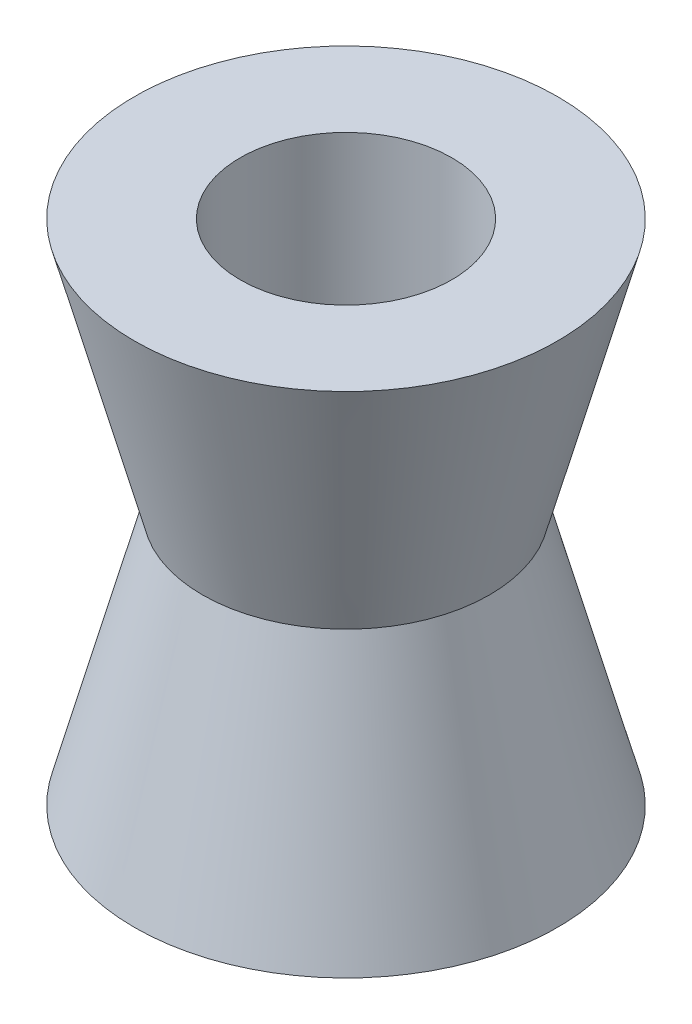
ISO-10303-21;
HEADER;
FILE_DESCRIPTION(('STEP AP214'),'2;1');
FILE_NAME('part.step','',(''),(''),'','','');
FILE_SCHEMA(('AUTOMOTIVE_DESIGN { 1 0 10303 214 1 1 1 1 }'));
ENDSEC;
DATA;
#1=APPLICATION_CONTEXT('core data for automotive mechanical design processes');
#2=APPLICATION_PROTOCOL_DEFINITION('international standard','automotive_design',2000,#1);
#3=PRODUCT_CONTEXT('',#1,'mechanical');
#4=PRODUCT('Part','Part','',(#3));
#5=PRODUCT_RELATED_PRODUCT_CATEGORY('part','',(#4));
#6=PRODUCT_DEFINITION_FORMATION('','',#4);
#7=PRODUCT_DEFINITION_CONTEXT('part definition',#1,'design');
#8=PRODUCT_DEFINITION('design','',#6,#7);
#9=PRODUCT_DEFINITION_SHAPE('','',#8);
#10=(LENGTH_UNIT() NAMED_UNIT(*) SI_UNIT(.MILLI.,.METRE.));
#11=(NAMED_UNIT(*) PLANE_ANGLE_UNIT() SI_UNIT($,.RADIAN.));
#12=(NAMED_UNIT(*) SI_UNIT($,.STERADIAN.) SOLID_ANGLE_UNIT());
#13=UNCERTAINTY_MEASURE_WITH_UNIT(LENGTH_MEASURE(1.E-05),#10,'distance_accuracy_value','');
#14=(GEOMETRIC_REPRESENTATION_CONTEXT(3) GLOBAL_UNCERTAINTY_ASSIGNED_CONTEXT((#13)) GLOBAL_UNIT_ASSIGNED_CONTEXT((#10,
#11,#12)) REPRESENTATION_CONTEXT('',''));
#15=CARTESIAN_POINT('',(0.,0.,0.));
#16=DIRECTION('',(0.,0.,1.));
#17=DIRECTION('',(1.,0.,0.));
#18=AXIS2_PLACEMENT_3D('',#15,#16,#17);
#19=CARTESIAN_POINT('',(0.,0.,0.));
#20=DIRECTION('',(0.,-1.,0.));
#21=DIRECTION('',(0.,0.,1.));
#22=AXIS2_PLACEMENT_3D('',#19,#20,#21);
#23=CONICAL_SURFACE('',#22,50.,0.26179938779915);
#24=CARTESIAN_POINT('',(0.,60.,0.));
#25=DIRECTION('',(0.,1.,0.));
#26=DIRECTION('',(0.,0.,1.));
#27=AXIS2_PLACEMENT_3D('',#24,#25,#26);
#28=CIRCLE('',#27,33.9230484541326);
#29=CARTESIAN_POINT('',(0.,60.,33.9230484541326));
#30=VERTEX_POINT('',#29);
#31=EDGE_CURVE('E10',#30,#30,#28,.T.);
#32=ORIENTED_EDGE('',*,*,#31,.F.);
#33=EDGE_LOOP('',(#32));
#34=FACE_BOUND('',#33,.T.);
#35=CARTESIAN_POINT('',(0.,0.,0.));
#36=DIRECTION('',(0.,1.,0.));
#37=DIRECTION('',(0.,0.,1.));
#38=AXIS2_PLACEMENT_3D('',#35,#36,#37);
#39=CIRCLE('',#38,50.);
#40=CARTESIAN_POINT('',(0.,0.,50.));
#41=VERTEX_POINT('',#40);
#42=EDGE_CURVE('E44',#41,#41,#39,.T.);
#43=ORIENTED_EDGE('',*,*,#42,.T.);
#44=EDGE_LOOP('',(#43));
#45=FACE_BOUND('',#44,.T.);
#46=ADVANCED_FACE('F37',(#34,#45),#23,.T.);
#47=CARTESIAN_POINT('',(0.,0.,0.));
#48=DIRECTION('',(0.,1.,0.));
#49=DIRECTION('',(0.,0.,1.));
#50=AXIS2_PLACEMENT_3D('',#47,#48,#49);
#51=PLANE('',#50);
#52=CARTESIAN_POINT('',(0.,0.,0.));
#53=DIRECTION('',(0.,1.,0.));
#54=DIRECTION('',(0.,0.,1.));
#55=AXIS2_PLACEMENT_3D('',#52,#53,#54);
#56=CIRCLE('',#55,25.);
#57=CARTESIAN_POINT('',(0.,0.,25.));
#58=VERTEX_POINT('',#57);
#59=EDGE_CURVE('E53',#58,#58,#56,.T.);
#60=ORIENTED_EDGE('',*,*,#59,.T.);
#61=EDGE_LOOP('',(#60));
#62=FACE_BOUND('',#61,.T.);
#63=ORIENTED_EDGE('',*,*,#42,.F.);
#64=EDGE_LOOP('',(#63));
#65=FACE_BOUND('',#64,.T.);
#66=ADVANCED_FACE('F73',(#62,#65),#51,.F.);
#67=CARTESIAN_POINT('',(0.,120.,0.));
#68=DIRECTION('',(0.,1.,0.));
#69=DIRECTION('',(0.,0.,1.));
#70=AXIS2_PLACEMENT_3D('',#67,#68,#69);
#71=CONICAL_SURFACE('',#70,50.,0.26179938779915);
#72=ORIENTED_EDGE('',*,*,#31,.T.);
#73=EDGE_LOOP('',(#72));
#74=FACE_BOUND('',#73,.T.);
#75=CARTESIAN_POINT('',(0.,120.,0.));
#76=DIRECTION('',(0.,1.,0.));
#77=DIRECTION('',(0.,0.,1.));
#78=AXIS2_PLACEMENT_3D('',#75,#76,#77);
#79=CIRCLE('',#78,50.);
#80=CARTESIAN_POINT('',(0.,120.,50.));
#81=VERTEX_POINT('',#80);
#82=EDGE_CURVE('E48',#81,#81,#79,.T.);
#83=ORIENTED_EDGE('',*,*,#82,.F.);
#84=EDGE_LOOP('',(#83));
#85=FACE_BOUND('',#84,.T.);
#86=ADVANCED_FACE('F70',(#74,#85),#71,.T.);
#87=CARTESIAN_POINT('',(0.,120.,0.));
#88=DIRECTION('',(0.,-1.,0.));
#89=DIRECTION('',(0.,0.,1.));
#90=AXIS2_PLACEMENT_3D('',#87,#88,#89);
#91=PLANE('',#90);
#92=CARTESIAN_POINT('',(0.,120.,0.));
#93=DIRECTION('',(0.,-1.,0.));
#94=DIRECTION('',(0.,0.,-1.));
#95=AXIS2_PLACEMENT_3D('',#92,#93,#94);
#96=CIRCLE('',#95,25.);
#97=CARTESIAN_POINT('',(0.,120.,-25.));
#98=VERTEX_POINT('',#97);
#99=EDGE_CURVE('E40',#98,#98,#96,.T.);
#100=ORIENTED_EDGE('',*,*,#99,.T.);
#101=EDGE_LOOP('',(#100));
#102=FACE_BOUND('',#101,.T.);
#103=ORIENTED_EDGE('',*,*,#82,.T.);
#104=EDGE_LOOP('',(#103));
#105=FACE_BOUND('',#104,.T.);
#106=ADVANCED_FACE('F60',(#102,#105),#91,.F.);
#107=CARTESIAN_POINT('',(0.,0.,0.));
#108=DIRECTION('',(0.,1.,0.));
#109=DIRECTION('',(0.,0.,1.));
#110=AXIS2_PLACEMENT_3D('',#107,#108,#109);
#111=CYLINDRICAL_SURFACE('',#110,25.);
#112=ORIENTED_EDGE('',*,*,#59,.F.);
#113=EDGE_LOOP('',(#112));
#114=FACE_BOUND('',#113,.T.);
#115=ORIENTED_EDGE('',*,*,#99,.F.);
#116=EDGE_LOOP('',(#115));
#117=FACE_BOUND('',#116,.T.);
#118=ADVANCED_FACE('F63',(#114,#117),#111,.F.);
#119=CLOSED_SHELL('',(#46,#66,#86,#106,#118));
#120=MANIFOLD_SOLID_BREP('B2',#119);
#121=ADVANCED_BREP_SHAPE_REPRESENTATION('',(#18,#120),#14);
#122=SHAPE_DEFINITION_REPRESENTATION(#9,#121);
ENDSEC;
END-ISO-10303-21;
